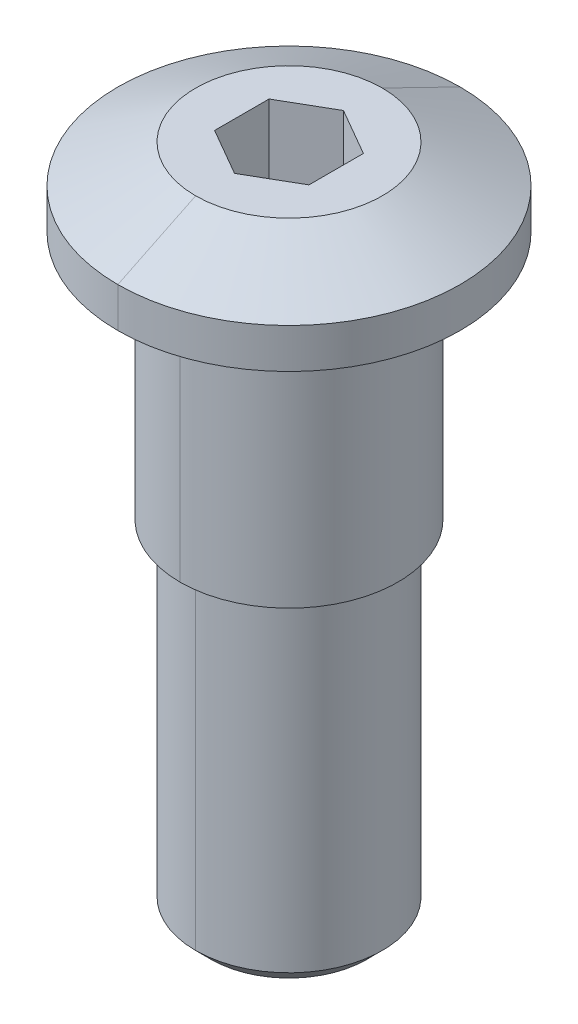
ISO-10303-21;
HEADER;
FILE_DESCRIPTION(('STEP AP214'),'2;1');
FILE_NAME('part.step','',(''),(''),'','','');
FILE_SCHEMA(('AUTOMOTIVE_DESIGN { 1 0 10303 214 1 1 1 1 }'));
ENDSEC;
DATA;
#1=APPLICATION_CONTEXT('core data for automotive mechanical design processes');
#2=APPLICATION_PROTOCOL_DEFINITION('international standard','automotive_design',2000,#1);
#3=PRODUCT_CONTEXT('',#1,'mechanical');
#4=PRODUCT('Part','Part','',(#3));
#5=PRODUCT_RELATED_PRODUCT_CATEGORY('part','',(#4));
#6=PRODUCT_DEFINITION_FORMATION('','',#4);
#7=PRODUCT_DEFINITION_CONTEXT('part definition',#1,'design');
#8=PRODUCT_DEFINITION('design','',#6,#7);
#9=PRODUCT_DEFINITION_SHAPE('','',#8);
#10=(LENGTH_UNIT() NAMED_UNIT(*) SI_UNIT(.MILLI.,.METRE.));
#11=(NAMED_UNIT(*) PLANE_ANGLE_UNIT() SI_UNIT($,.RADIAN.));
#12=(NAMED_UNIT(*) SI_UNIT($,.STERADIAN.) SOLID_ANGLE_UNIT());
#13=UNCERTAINTY_MEASURE_WITH_UNIT(LENGTH_MEASURE(1.E-05),#10,'distance_accuracy_value','');
#14=(GEOMETRIC_REPRESENTATION_CONTEXT(3) GLOBAL_UNCERTAINTY_ASSIGNED_CONTEXT((#13)) GLOBAL_UNIT_ASSIGNED_CONTEXT((#10,
#11,#12)) REPRESENTATION_CONTEXT('',''));
#15=CARTESIAN_POINT('',(0.,0.,0.));
#16=DIRECTION('',(0.,0.,1.));
#17=DIRECTION('',(1.,0.,0.));
#18=AXIS2_PLACEMENT_3D('',#15,#16,#17);
#19=CARTESIAN_POINT('',(0.,-3.,0.));
#20=DIRECTION('',(0.,1.,0.));
#21=DIRECTION('',(0.,0.,1.));
#22=AXIS2_PLACEMENT_3D('',#19,#20,#21);
#23=PLANE('',#22);
#24=DIRECTION('',(0.866025403784429,0.,-0.500000000000017));
#25=VECTOR('',#24,1.);
#26=CARTESIAN_POINT('',(0.,-3.,1.75));
#27=LINE('',#26,#25);
#28=CARTESIAN_POINT('',(0.,-3.,1.75000000000003));
#29=VERTEX_POINT('',#28);
#30=CARTESIAN_POINT('',(1.51554445662296,-3.,0.874999999999935));
#31=VERTEX_POINT('',#30);
#32=EDGE_CURVE('E125',#29,#31,#27,.T.);
#33=ORIENTED_EDGE('',*,*,#32,.T.);
#34=DIRECTION('',(0.,0.,-1.));
#35=VECTOR('',#34,1.);
#36=CARTESIAN_POINT('',(1.515544456623,-3.,0.875));
#37=LINE('',#36,#35);
#38=CARTESIAN_POINT('',(1.515544456623,-3.,-0.875));
#39=VERTEX_POINT('',#38);
#40=EDGE_CURVE('E215',#31,#39,#37,.T.);
#41=ORIENTED_EDGE('',*,*,#40,.T.);
#42=DIRECTION('',(-0.866025403784429,0.,-0.500000000000017));
#43=VECTOR('',#42,1.);
#44=CARTESIAN_POINT('',(1.515544456623,-3.,-0.875));
#45=LINE('',#44,#43);
#46=CARTESIAN_POINT('',(0.,-3.,-1.75000000000003));
#47=VERTEX_POINT('',#46);
#48=EDGE_CURVE('E220',#39,#47,#45,.T.);
#49=ORIENTED_EDGE('',*,*,#48,.T.);
#50=DIRECTION('',(-0.866025403784429,0.,0.500000000000017));
#51=VECTOR('',#50,1.);
#52=CARTESIAN_POINT('',(0.,-3.,-1.75));
#53=LINE('',#52,#51);
#54=CARTESIAN_POINT('',(-1.51554445662298,-3.,-0.874999999999967));
#55=VERTEX_POINT('',#54);
#56=EDGE_CURVE('E224',#47,#55,#53,.T.);
#57=ORIENTED_EDGE('',*,*,#56,.T.);
#58=DIRECTION('',(0.,0.,1.));
#59=VECTOR('',#58,1.);
#60=CARTESIAN_POINT('',(-1.515544456623,-3.,-0.875));
#61=LINE('',#60,#59);
#62=CARTESIAN_POINT('',(-1.515544456623,-3.,0.875));
#63=VERTEX_POINT('',#62);
#64=EDGE_CURVE('E121',#55,#63,#61,.T.);
#65=ORIENTED_EDGE('',*,*,#64,.T.);
#66=DIRECTION('',(0.866025403784429,0.,0.500000000000017));
#67=VECTOR('',#66,1.);
#68=CARTESIAN_POINT('',(-1.515544456623,-3.,0.875));
#69=LINE('',#68,#67);
#70=EDGE_CURVE('E123',#63,#29,#69,.T.);
#71=ORIENTED_EDGE('',*,*,#70,.T.);
#72=EDGE_LOOP('',(#33,#41,#49,#57,#65,#71));
#73=FACE_BOUND('',#72,.T.);
#74=ADVANCED_FACE('F17',(#73),#23,.T.);
#75=CARTESIAN_POINT('',(0.,-3.,1.75));
#76=DIRECTION('',(0.500000000000017,0.,0.866025403784429));
#77=DIRECTION('',(0.866025403784429,0.,-0.500000000000017));
#78=AXIS2_PLACEMENT_3D('',#75,#76,#77);
#79=PLANE('',#78);
#80=ORIENTED_EDGE('',*,*,#32,.F.);
#81=DIRECTION('',(0.,1.,0.));
#82=VECTOR('',#81,1.);
#83=CARTESIAN_POINT('',(0.,-3.,1.75000000000013));
#84=LINE('',#83,#82);
#85=CARTESIAN_POINT('',(0.,0.,1.75000000000003));
#86=VERTEX_POINT('',#85);
#87=EDGE_CURVE('E130',#29,#86,#84,.T.);
#88=ORIENTED_EDGE('',*,*,#87,.T.);
#89=DIRECTION('',(-0.866025403784472,0.,0.499999999999943));
#90=VECTOR('',#89,1.);
#91=CARTESIAN_POINT('',(1.515544456623,0.,0.875));
#92=LINE('',#91,#90);
#93=CARTESIAN_POINT('',(1.51554445662296,0.,0.874999999999935));
#94=VERTEX_POINT('',#93);
#95=EDGE_CURVE('E212',#94,#86,#92,.T.);
#96=ORIENTED_EDGE('',*,*,#95,.F.);
#97=DIRECTION('',(0.,1.,0.));
#98=VECTOR('',#97,1.);
#99=CARTESIAN_POINT('',(1.515544456623,-3.,0.875));
#100=LINE('',#99,#98);
#101=EDGE_CURVE('E136',#94,#31,#100,.F.);
#102=ORIENTED_EDGE('',*,*,#101,.T.);
#103=EDGE_LOOP('',(#80,#88,#96,#102));
#104=FACE_BOUND('',#103,.T.);
#105=ADVANCED_FACE('F133',(#104),#79,.F.);
#106=CARTESIAN_POINT('',(-1.515544456623,-3.,0.875));
#107=DIRECTION('',(-0.500000000000017,0.,0.866025403784429));
#108=DIRECTION('',(0.866025403784429,0.,0.500000000000017));
#109=AXIS2_PLACEMENT_3D('',#106,#107,#108);
#110=PLANE('',#109);
#111=ORIENTED_EDGE('',*,*,#70,.F.);
#112=DIRECTION('',(0.,1.,0.));
#113=VECTOR('',#112,1.);
#114=CARTESIAN_POINT('',(-1.515544456623,-3.,0.875));
#115=LINE('',#114,#113);
#116=CARTESIAN_POINT('',(-1.515544456623,0.,0.875));
#117=VERTEX_POINT('',#116);
#118=EDGE_CURVE('E144',#63,#117,#115,.T.);
#119=ORIENTED_EDGE('',*,*,#118,.T.);
#120=DIRECTION('',(-0.866025403784472,0.,-0.499999999999943));
#121=VECTOR('',#120,1.);
#122=CARTESIAN_POINT('',(0.,0.,1.75));
#123=LINE('',#122,#121);
#124=EDGE_CURVE('E141',#86,#117,#123,.T.);
#125=ORIENTED_EDGE('',*,*,#124,.F.);
#126=ORIENTED_EDGE('',*,*,#87,.F.);
#127=EDGE_LOOP('',(#111,#119,#125,#126));
#128=FACE_BOUND('',#127,.T.);
#129=ADVANCED_FACE('F139',(#128),#110,.F.);
#130=CARTESIAN_POINT('',(-1.515544456623,-3.,-0.875));
#131=DIRECTION('',(-1.,0.,0.));
#132=DIRECTION('',(0.,0.,1.));
#133=AXIS2_PLACEMENT_3D('',#130,#131,#132);
#134=PLANE('',#133);
#135=ORIENTED_EDGE('',*,*,#64,.F.);
#136=DIRECTION('',(0.,1.,0.));
#137=VECTOR('',#136,1.);
#138=CARTESIAN_POINT('',(-1.51554445662293,-3.,-0.87499999999987));
#139=LINE('',#138,#137);
#140=CARTESIAN_POINT('',(-1.51554445662298,0.,-0.874999999999967));
#141=VERTEX_POINT('',#140);
#142=EDGE_CURVE('E222',#55,#141,#139,.T.);
#143=ORIENTED_EDGE('',*,*,#142,.T.);
#144=DIRECTION('',(0.,0.,1.));
#145=VECTOR('',#144,1.);
#146=CARTESIAN_POINT('',(-1.515544456623,0.,3.));
#147=LINE('',#146,#145);
#148=EDGE_CURVE('E208',#117,#141,#147,.F.);
#149=ORIENTED_EDGE('',*,*,#148,.F.);
#150=ORIENTED_EDGE('',*,*,#118,.F.);
#151=EDGE_LOOP('',(#135,#143,#149,#150));
#152=FACE_BOUND('',#151,.T.);
#153=ADVANCED_FACE('F227',(#152),#134,.F.);
#154=CARTESIAN_POINT('',(0.,-3.,-1.75));
#155=DIRECTION('',(-0.500000000000017,0.,-0.866025403784429));
#156=DIRECTION('',(-0.866025403784429,0.,0.500000000000017));
#157=AXIS2_PLACEMENT_3D('',#154,#155,#156);
#158=PLANE('',#157);
#159=ORIENTED_EDGE('',*,*,#56,.F.);
#160=DIRECTION('',(0.,1.,0.));
#161=VECTOR('',#160,1.);
#162=CARTESIAN_POINT('',(0.,-3.,-1.75000000000013));
#163=LINE('',#162,#161);
#164=CARTESIAN_POINT('',(0.,0.,-1.75000000000003));
#165=VERTEX_POINT('',#164);
#166=EDGE_CURVE('E218',#47,#165,#163,.T.);
#167=ORIENTED_EDGE('',*,*,#166,.T.);
#168=DIRECTION('',(0.866025403784472,0.,-0.499999999999943));
#169=VECTOR('',#168,1.);
#170=CARTESIAN_POINT('',(-1.515544456623,0.,-0.875));
#171=LINE('',#170,#169);
#172=EDGE_CURVE('E205',#141,#165,#171,.T.);
#173=ORIENTED_EDGE('',*,*,#172,.F.);
#174=ORIENTED_EDGE('',*,*,#142,.F.);
#175=EDGE_LOOP('',(#159,#167,#173,#174));
#176=FACE_BOUND('',#175,.T.);
#177=ADVANCED_FACE('F238',(#176),#158,.F.);
#178=CARTESIAN_POINT('',(1.515544456623,-3.,-0.875));
#179=DIRECTION('',(0.500000000000017,0.,-0.866025403784429));
#180=DIRECTION('',(-0.866025403784429,0.,-0.500000000000017));
#181=AXIS2_PLACEMENT_3D('',#178,#179,#180);
#182=PLANE('',#181);
#183=ORIENTED_EDGE('',*,*,#48,.F.);
#184=DIRECTION('',(0.,1.,0.));
#185=VECTOR('',#184,1.);
#186=CARTESIAN_POINT('',(1.515544456623,-3.,-0.875));
#187=LINE('',#186,#185);
#188=CARTESIAN_POINT('',(1.515544456623,0.,-0.875));
#189=VERTEX_POINT('',#188);
#190=EDGE_CURVE('E82',#39,#189,#187,.T.);
#191=ORIENTED_EDGE('',*,*,#190,.T.);
#192=DIRECTION('',(0.866025403784472,0.,0.499999999999943));
#193=VECTOR('',#192,1.);
#194=CARTESIAN_POINT('',(0.,0.,-1.75));
#195=LINE('',#194,#193);
#196=EDGE_CURVE('E202',#165,#189,#195,.T.);
#197=ORIENTED_EDGE('',*,*,#196,.F.);
#198=ORIENTED_EDGE('',*,*,#166,.F.);
#199=EDGE_LOOP('',(#183,#191,#197,#198));
#200=FACE_BOUND('',#199,.T.);
#201=ADVANCED_FACE('F236',(#200),#182,.F.);
#202=CARTESIAN_POINT('',(1.515544456623,-3.,0.875));
#203=DIRECTION('',(1.,0.,0.));
#204=DIRECTION('',(0.,0.,-1.));
#205=AXIS2_PLACEMENT_3D('',#202,#203,#204);
#206=PLANE('',#205);
#207=ORIENTED_EDGE('',*,*,#40,.F.);
#208=ORIENTED_EDGE('',*,*,#101,.F.);
#209=DIRECTION('',(0.,0.,1.));
#210=VECTOR('',#209,1.);
#211=CARTESIAN_POINT('',(1.515544456623,0.,3.));
#212=LINE('',#211,#210);
#213=EDGE_CURVE('E199',#189,#94,#212,.T.);
#214=ORIENTED_EDGE('',*,*,#213,.F.);
#215=ORIENTED_EDGE('',*,*,#190,.F.);
#216=EDGE_LOOP('',(#207,#208,#214,#215));
#217=FACE_BOUND('',#216,.T.);
#218=ADVANCED_FACE('F233',(#217),#206,.F.);
#219=CARTESIAN_POINT('',(0.,0.,3.));
#220=DIRECTION('',(0.,1.,0.));
#221=DIRECTION('',(0.,0.,1.));
#222=AXIS2_PLACEMENT_3D('',#219,#220,#221);
#223=PLANE('',#222);
#224=ORIENTED_EDGE('',*,*,#196,.T.);
#225=ORIENTED_EDGE('',*,*,#213,.T.);
#226=ORIENTED_EDGE('',*,*,#95,.T.);
#227=ORIENTED_EDGE('',*,*,#124,.T.);
#228=ORIENTED_EDGE('',*,*,#148,.T.);
#229=ORIENTED_EDGE('',*,*,#172,.T.);
#230=EDGE_LOOP('',(#224,#225,#226,#227,#228,#229));
#231=FACE_BOUND('',#230,.T.);
#232=CARTESIAN_POINT('',(0.,0.,0.));
#233=DIRECTION('',(0.,-1.,0.));
#234=DIRECTION('',(0.,0.,-1.));
#235=AXIS2_PLACEMENT_3D('',#232,#233,#234);
#236=CIRCLE('',#235,2.99999999998591);
#237=CARTESIAN_POINT('',(0.,0.,-2.99999999998591));
#238=VERTEX_POINT('',#237);
#239=CARTESIAN_POINT('',(0.,0.,2.99999999998591));
#240=VERTEX_POINT('',#239);
#241=EDGE_CURVE('E180',#238,#240,#236,.T.);
#242=ORIENTED_EDGE('',*,*,#241,.F.);
#243=CARTESIAN_POINT('',(0.,0.,0.));
#244=DIRECTION('',(0.,-1.,0.));
#245=DIRECTION('',(0.,0.,-1.));
#246=AXIS2_PLACEMENT_3D('',#243,#244,#245);
#247=CIRCLE('',#246,2.99999999998591);
#248=EDGE_CURVE('E20',#240,#238,#247,.T.);
#249=ORIENTED_EDGE('',*,*,#248,.F.);
#250=EDGE_LOOP('',(#242,#249));
#251=FACE_BOUND('',#250,.T.);
#252=ADVANCED_FACE('F231',(#231,#251),#223,.T.);
#253=CARTESIAN_POINT('',(0.,-1.21933147141817,0.));
#254=DIRECTION('',(0.,-1.,0.));
#255=DIRECTION('',(0.,0.,-1.));
#256=AXIS2_PLACEMENT_3D('',#253,#254,#255);
#257=CONICAL_SURFACE('',#256,5.50000000004047,1.11701072128383);
#258=CARTESIAN_POINT('',(0.,-1.219331471415,0.));
#259=DIRECTION('',(0.,1.,0.));
#260=DIRECTION('',(0.,0.,1.));
#261=AXIS2_PLACEMENT_3D('',#258,#259,#260);
#262=CIRCLE('',#261,5.5);
#263=CARTESIAN_POINT('',(0.,-1.21933147141579,5.50000000001012));
#264=VERTEX_POINT('',#263);
#265=CARTESIAN_POINT('',(0.,-1.21933147140158,-5.4999999999817));
#266=VERTEX_POINT('',#265);
#267=EDGE_CURVE('E182',#264,#266,#262,.F.);
#268=ORIENTED_EDGE('',*,*,#267,.F.);
#269=DIRECTION('',(0.,0.438371146789267,-0.898794046299075));
#270=VECTOR('',#269,1.);
#271=CARTESIAN_POINT('',(6.11078570557366E-11,-243377.09849673,499000.));
#272=LINE('',#271,#270);
#273=EDGE_CURVE('E190',#240,#264,#272,.F.);
#274=ORIENTED_EDGE('',*,*,#273,.F.);
#275=ORIENTED_EDGE('',*,*,#248,.T.);
#276=DIRECTION('',(0.,0.438371146789267,0.898794046299075));
#277=VECTOR('',#276,1.);
#278=CARTESIAN_POINT('',(0.,-243377.09849673,-499000.));
#279=LINE('',#278,#277);
#280=EDGE_CURVE('E183',#266,#238,#279,.T.);
#281=ORIENTED_EDGE('',*,*,#280,.F.);
#282=EDGE_LOOP('',(#268,#274,#275,#281));
#283=FACE_BOUND('',#282,.T.);
#284=ADVANCED_FACE('F297',(#283),#257,.T.);
#285=CARTESIAN_POINT('',(0.,-1.21933147141817,0.));
#286=DIRECTION('',(0.,-1.,0.));
#287=DIRECTION('',(0.,0.,-1.));
#288=AXIS2_PLACEMENT_3D('',#285,#286,#287);
#289=CONICAL_SURFACE('',#288,5.50000000004047,1.11701072128383);
#290=ORIENTED_EDGE('',*,*,#280,.T.);
#291=ORIENTED_EDGE('',*,*,#241,.T.);
#292=ORIENTED_EDGE('',*,*,#273,.T.);
#293=CARTESIAN_POINT('',(0.,-1.219331471415,0.));
#294=DIRECTION('',(0.,1.,0.));
#295=DIRECTION('',(0.,0.,1.));
#296=AXIS2_PLACEMENT_3D('',#293,#294,#295);
#297=CIRCLE('',#296,5.5);
#298=EDGE_CURVE('E439',#266,#264,#297,.F.);
#299=ORIENTED_EDGE('',*,*,#298,.F.);
#300=EDGE_LOOP('',(#290,#291,#292,#299));
#301=FACE_BOUND('',#300,.T.);
#302=ADVANCED_FACE('F293',(#301),#289,.T.);
#303=CARTESIAN_POINT('',(0.,0.,0.));
#304=DIRECTION('',(0.,1.,0.));
#305=DIRECTION('',(0.,0.,1.));
#306=AXIS2_PLACEMENT_3D('',#303,#304,#305);
#307=CYLINDRICAL_SURFACE('',#306,5.5);
#308=ORIENTED_EDGE('',*,*,#267,.T.);
#309=DIRECTION('',(0.,1.,0.));
#310=VECTOR('',#309,1.);
#311=CARTESIAN_POINT('',(0.,0.,-5.5));
#312=LINE('',#311,#310);
#313=CARTESIAN_POINT('',(0.,-2.5,-5.5));
#314=VERTEX_POINT('',#313);
#315=EDGE_CURVE('E188',#314,#266,#312,.T.);
#316=ORIENTED_EDGE('',*,*,#315,.F.);
#317=CARTESIAN_POINT('',(0.,-2.5,0.));
#318=DIRECTION('',(0.,1.,0.));
#319=DIRECTION('',(0.,0.,1.));
#320=AXIS2_PLACEMENT_3D('',#317,#318,#319);
#321=CIRCLE('',#320,5.5);
#322=CARTESIAN_POINT('',(0.,-2.5,5.5));
#323=VERTEX_POINT('',#322);
#324=EDGE_CURVE('E177',#323,#314,#321,.F.);
#325=ORIENTED_EDGE('',*,*,#324,.F.);
#326=DIRECTION('',(0.,1.,0.));
#327=VECTOR('',#326,1.);
#328=CARTESIAN_POINT('',(0.,0.,5.5));
#329=LINE('',#328,#327);
#330=EDGE_CURVE('E179',#264,#323,#329,.F.);
#331=ORIENTED_EDGE('',*,*,#330,.F.);
#332=EDGE_LOOP('',(#308,#316,#325,#331));
#333=FACE_BOUND('',#332,.T.);
#334=ADVANCED_FACE('F289',(#333),#307,.T.);
#335=CARTESIAN_POINT('',(0.,0.,0.));
#336=DIRECTION('',(0.,1.,0.));
#337=DIRECTION('',(0.,0.,1.));
#338=AXIS2_PLACEMENT_3D('',#335,#336,#337);
#339=CYLINDRICAL_SURFACE('',#338,5.5);
#340=ORIENTED_EDGE('',*,*,#330,.T.);
#341=CARTESIAN_POINT('',(0.,-2.5,0.));
#342=DIRECTION('',(0.,1.,0.));
#343=DIRECTION('',(0.,0.,1.));
#344=AXIS2_PLACEMENT_3D('',#341,#342,#343);
#345=CIRCLE('',#344,5.5);
#346=EDGE_CURVE('E174',#314,#323,#345,.F.);
#347=ORIENTED_EDGE('',*,*,#346,.F.);
#348=ORIENTED_EDGE('',*,*,#315,.T.);
#349=ORIENTED_EDGE('',*,*,#298,.T.);
#350=EDGE_LOOP('',(#340,#347,#348,#349));
#351=FACE_BOUND('',#350,.T.);
#352=ADVANCED_FACE('F285',(#351),#339,.T.);
#353=CARTESIAN_POINT('',(0.,-2.5,3.5));
#354=DIRECTION('',(0.,-1.,0.));
#355=DIRECTION('',(0.,0.,-1.));
#356=AXIS2_PLACEMENT_3D('',#353,#354,#355);
#357=PLANE('',#356);
#358=CARTESIAN_POINT('',(0.,-2.5,0.));
#359=DIRECTION('',(0.,1.,0.));
#360=DIRECTION('',(0.,0.,1.));
#361=AXIS2_PLACEMENT_3D('',#358,#359,#360);
#362=CIRCLE('',#361,3.5);
#363=CARTESIAN_POINT('',(0.,-2.5,3.5));
#364=VERTEX_POINT('',#363);
#365=CARTESIAN_POINT('',(0.,-2.5,-3.5));
#366=VERTEX_POINT('',#365);
#367=EDGE_CURVE('E172',#364,#366,#362,.F.);
#368=ORIENTED_EDGE('',*,*,#367,.F.);
#369=CARTESIAN_POINT('',(0.,-2.5,0.));
#370=DIRECTION('',(0.,1.,0.));
#371=DIRECTION('',(0.,0.,1.));
#372=AXIS2_PLACEMENT_3D('',#369,#370,#371);
#373=CIRCLE('',#372,3.5);
#374=EDGE_CURVE('E168',#366,#364,#373,.F.);
#375=ORIENTED_EDGE('',*,*,#374,.F.);
#376=EDGE_LOOP('',(#368,#375));
#377=FACE_BOUND('',#376,.T.);
#378=ORIENTED_EDGE('',*,*,#324,.T.);
#379=ORIENTED_EDGE('',*,*,#346,.T.);
#380=EDGE_LOOP('',(#378,#379));
#381=FACE_BOUND('',#380,.T.);
#382=ADVANCED_FACE('F281',(#377,#381),#357,.T.);
#383=CARTESIAN_POINT('',(0.,-21.5,0.));
#384=DIRECTION('',(0.,-1.,0.));
#385=DIRECTION('',(0.,0.,-1.));
#386=AXIS2_PLACEMENT_3D('',#383,#384,#385);
#387=PLANE('',#386);
#388=CARTESIAN_POINT('',(0.,-21.4999999999464,0.));
#389=DIRECTION('',(0.,1.,0.));
#390=DIRECTION('',(0.,0.,1.));
#391=AXIS2_PLACEMENT_3D('',#388,#389,#390);
#392=CIRCLE('',#391,2.49999999999772);
#393=CARTESIAN_POINT('',(0.,-21.4999999999179,2.50000000002615));
#394=VERTEX_POINT('',#393);
#395=CARTESIAN_POINT('',(0.,-21.4999999999464,-2.49999999999772));
#396=VERTEX_POINT('',#395);
#397=EDGE_CURVE('E164',#394,#396,#392,.T.);
#398=ORIENTED_EDGE('',*,*,#397,.F.);
#399=CARTESIAN_POINT('',(0.,-21.4999999999464,0.));
#400=DIRECTION('',(0.,1.,0.));
#401=DIRECTION('',(0.,0.,1.));
#402=AXIS2_PLACEMENT_3D('',#399,#400,#401);
#403=CIRCLE('',#402,2.49999999999772);
#404=EDGE_CURVE('E160',#396,#394,#403,.T.);
#405=ORIENTED_EDGE('',*,*,#404,.F.);
#406=EDGE_LOOP('',(#398,#405));
#407=FACE_BOUND('',#406,.T.);
#408=ADVANCED_FACE('F277',(#407),#387,.T.);
#409=CARTESIAN_POINT('',(0.,0.,0.));
#410=DIRECTION('',(0.,1.,0.));
#411=DIRECTION('',(0.,0.,1.));
#412=AXIS2_PLACEMENT_3D('',#409,#410,#411);
#413=CYLINDRICAL_SURFACE('',#412,3.5);
#414=ORIENTED_EDGE('',*,*,#367,.T.);
#415=DIRECTION('',(0.,1.,0.));
#416=VECTOR('',#415,1.);
#417=CARTESIAN_POINT('',(0.,0.,-3.5));
#418=LINE('',#417,#416);
#419=CARTESIAN_POINT('',(0.,-10.5,-3.5));
#420=VERTEX_POINT('',#419);
#421=EDGE_CURVE('E171',#420,#366,#418,.T.);
#422=ORIENTED_EDGE('',*,*,#421,.F.);
#423=CARTESIAN_POINT('',(0.,-10.5,0.));
#424=DIRECTION('',(0.,1.,0.));
#425=DIRECTION('',(0.,0.,1.));
#426=AXIS2_PLACEMENT_3D('',#423,#424,#425);
#427=CIRCLE('',#426,3.5);
#428=CARTESIAN_POINT('',(0.,-10.5,3.5));
#429=VERTEX_POINT('',#428);
#430=EDGE_CURVE('E156',#429,#420,#427,.F.);
#431=ORIENTED_EDGE('',*,*,#430,.F.);
#432=DIRECTION('',(0.,1.,0.));
#433=VECTOR('',#432,1.);
#434=CARTESIAN_POINT('',(0.,0.,3.5));
#435=LINE('',#434,#433);
#436=EDGE_CURVE('E167',#364,#429,#435,.F.);
#437=ORIENTED_EDGE('',*,*,#436,.F.);
#438=EDGE_LOOP('',(#414,#422,#431,#437));
#439=FACE_BOUND('',#438,.T.);
#440=ADVANCED_FACE('F273',(#439),#413,.T.);
#441=CARTESIAN_POINT('',(0.,0.,0.));
#442=DIRECTION('',(0.,1.,0.));
#443=DIRECTION('',(0.,0.,1.));
#444=AXIS2_PLACEMENT_3D('',#441,#442,#443);
#445=CYLINDRICAL_SURFACE('',#444,3.5);
#446=ORIENTED_EDGE('',*,*,#436,.T.);
#447=CARTESIAN_POINT('',(0.,-10.5,0.));
#448=DIRECTION('',(0.,1.,0.));
#449=DIRECTION('',(0.,0.,1.));
#450=AXIS2_PLACEMENT_3D('',#447,#448,#449);
#451=CIRCLE('',#450,3.5);
#452=EDGE_CURVE('E153',#420,#429,#451,.F.);
#453=ORIENTED_EDGE('',*,*,#452,.F.);
#454=ORIENTED_EDGE('',*,*,#421,.T.);
#455=ORIENTED_EDGE('',*,*,#374,.T.);
#456=EDGE_LOOP('',(#446,#453,#454,#455));
#457=FACE_BOUND('',#456,.T.);
#458=ADVANCED_FACE('F269',(#457),#445,.T.);
#459=CARTESIAN_POINT('',(0.,-21.0000000000719,0.));
#460=DIRECTION('',(0.,1.,0.));
#461=DIRECTION('',(0.,0.,1.));
#462=AXIS2_PLACEMENT_3D('',#459,#460,#461);
#463=CONICAL_SURFACE('',#462,2.99999999992906,0.785398163454292);
#464=DIRECTION('',(0.,-0.707106781186652,-0.707106781186443));
#465=VECTOR('',#464,1.);
#466=CARTESIAN_POINT('',(0.,498976.000000148,499000.));
#467=LINE('',#466,#465);
#468=CARTESIAN_POINT('',(0.,-21.000000000018,2.99999999998227));
#469=VERTEX_POINT('',#468);
#470=EDGE_CURVE('E163',#394,#469,#467,.F.);
#471=ORIENTED_EDGE('',*,*,#470,.F.);
#472=ORIENTED_EDGE('',*,*,#397,.T.);
#473=DIRECTION('',(0.,-0.707106781186652,0.707106781186443));
#474=VECTOR('',#473,1.);
#475=CARTESIAN_POINT('',(6.11078570557366E-11,498976.000000148,-499000.));
#476=LINE('',#475,#474);
#477=CARTESIAN_POINT('',(0.,-21.000000000018,-2.99999999998227));
#478=VERTEX_POINT('',#477);
#479=EDGE_CURVE('E159',#478,#396,#476,.T.);
#480=ORIENTED_EDGE('',*,*,#479,.F.);
#481=CARTESIAN_POINT('',(0.,-21.,0.));
#482=DIRECTION('',(0.,1.,0.));
#483=DIRECTION('',(0.,0.,1.));
#484=AXIS2_PLACEMENT_3D('',#481,#482,#483);
#485=CIRCLE('',#484,3.);
#486=EDGE_CURVE('E152',#469,#478,#485,.T.);
#487=ORIENTED_EDGE('',*,*,#486,.F.);
#488=EDGE_LOOP('',(#471,#472,#480,#487));
#489=FACE_BOUND('',#488,.T.);
#490=ADVANCED_FACE('F265',(#489),#463,.T.);
#491=CARTESIAN_POINT('',(0.,-21.0000000000719,0.));
#492=DIRECTION('',(0.,1.,0.));
#493=DIRECTION('',(0.,0.,1.));
#494=AXIS2_PLACEMENT_3D('',#491,#492,#493);
#495=CONICAL_SURFACE('',#494,2.99999999992906,0.785398163454292);
#496=CARTESIAN_POINT('',(0.,-21.,0.));
#497=DIRECTION('',(0.,1.,0.));
#498=DIRECTION('',(0.,0.,1.));
#499=AXIS2_PLACEMENT_3D('',#496,#497,#498);
#500=CIRCLE('',#499,3.);
#501=EDGE_CURVE('E469',#478,#469,#500,.T.);
#502=ORIENTED_EDGE('',*,*,#501,.F.);
#503=ORIENTED_EDGE('',*,*,#479,.T.);
#504=ORIENTED_EDGE('',*,*,#404,.T.);
#505=ORIENTED_EDGE('',*,*,#470,.T.);
#506=EDGE_LOOP('',(#502,#503,#504,#505));
#507=FACE_BOUND('',#506,.T.);
#508=ADVANCED_FACE('F262',(#507),#495,.T.);
#509=CARTESIAN_POINT('',(0.,-10.5,3.));
#510=DIRECTION('',(0.,-1.,0.));
#511=DIRECTION('',(0.,0.,-1.));
#512=AXIS2_PLACEMENT_3D('',#509,#510,#511);
#513=PLANE('',#512);
#514=CARTESIAN_POINT('',(0.,-10.5,0.));
#515=DIRECTION('',(0.,1.,0.));
#516=DIRECTION('',(0.,0.,1.));
#517=AXIS2_PLACEMENT_3D('',#514,#515,#516);
#518=CIRCLE('',#517,3.);
#519=CARTESIAN_POINT('',(0.,-10.5,3.));
#520=VERTEX_POINT('',#519);
#521=CARTESIAN_POINT('',(0.,-10.5,-3.));
#522=VERTEX_POINT('',#521);
#523=EDGE_CURVE('E26',#520,#522,#518,.F.);
#524=ORIENTED_EDGE('',*,*,#523,.F.);
#525=CARTESIAN_POINT('',(0.,-10.5,0.));
#526=DIRECTION('',(0.,1.,0.));
#527=DIRECTION('',(0.,0.,1.));
#528=AXIS2_PLACEMENT_3D('',#525,#526,#527);
#529=CIRCLE('',#528,3.);
#530=EDGE_CURVE('E34',#522,#520,#529,.F.);
#531=ORIENTED_EDGE('',*,*,#530,.F.);
#532=EDGE_LOOP('',(#524,#531));
#533=FACE_BOUND('',#532,.T.);
#534=ORIENTED_EDGE('',*,*,#430,.T.);
#535=ORIENTED_EDGE('',*,*,#452,.T.);
#536=EDGE_LOOP('',(#534,#535));
#537=FACE_BOUND('',#536,.T.);
#538=ADVANCED_FACE('F256',(#533,#537),#513,.T.);
#539=CARTESIAN_POINT('',(0.,0.,0.));
#540=DIRECTION('',(0.,1.,0.));
#541=DIRECTION('',(0.,0.,1.));
#542=AXIS2_PLACEMENT_3D('',#539,#540,#541);
#543=CYLINDRICAL_SURFACE('',#542,3.);
#544=DIRECTION('',(0.,1.,0.));
#545=VECTOR('',#544,1.);
#546=CARTESIAN_POINT('',(0.,0.,3.));
#547=LINE('',#546,#545);
#548=EDGE_CURVE('E150',#469,#520,#547,.T.);
#549=ORIENTED_EDGE('',*,*,#548,.F.);
#550=ORIENTED_EDGE('',*,*,#486,.T.);
#551=DIRECTION('',(0.,1.,0.));
#552=VECTOR('',#551,1.);
#553=CARTESIAN_POINT('',(0.,0.,-3.));
#554=LINE('',#553,#552);
#555=EDGE_CURVE('E11',#522,#478,#554,.F.);
#556=ORIENTED_EDGE('',*,*,#555,.F.);
#557=ORIENTED_EDGE('',*,*,#530,.T.);
#558=EDGE_LOOP('',(#549,#550,#556,#557));
#559=FACE_BOUND('',#558,.T.);
#560=ADVANCED_FACE('F250',(#559),#543,.T.);
#561=CARTESIAN_POINT('',(0.,0.,0.));
#562=DIRECTION('',(0.,1.,0.));
#563=DIRECTION('',(0.,0.,1.));
#564=AXIS2_PLACEMENT_3D('',#561,#562,#563);
#565=CYLINDRICAL_SURFACE('',#564,3.);
#566=ORIENTED_EDGE('',*,*,#523,.T.);
#567=ORIENTED_EDGE('',*,*,#555,.T.);
#568=ORIENTED_EDGE('',*,*,#501,.T.);
#569=ORIENTED_EDGE('',*,*,#548,.T.);
#570=EDGE_LOOP('',(#566,#567,#568,#569));
#571=FACE_BOUND('',#570,.T.);
#572=ADVANCED_FACE('F248',(#571),#565,.T.);
#573=CLOSED_SHELL('',(#74,#105,#129,#153,#177,#201,#218,#252,#284,#302,#334,#352,#382,#408,#440,
#458,#490,#508,#538,#560,#572));
#574=MANIFOLD_SOLID_BREP('B1',#573);
#575=ADVANCED_BREP_SHAPE_REPRESENTATION('',(#18,#574),#14);
#576=SHAPE_DEFINITION_REPRESENTATION(#9,#575);
ENDSEC;
END-ISO-10303-21;
